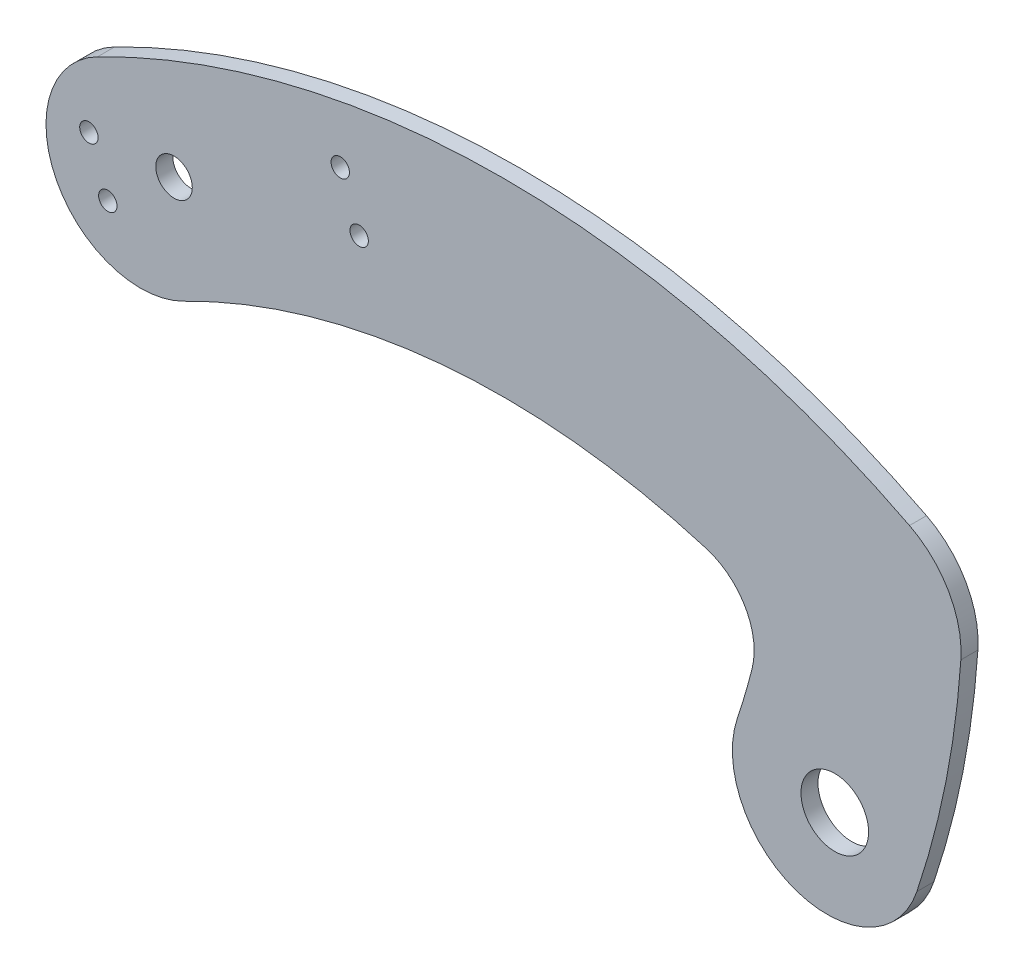
ISO-10303-21;
HEADER;
FILE_DESCRIPTION(('STEP AP214'),'2;1');
FILE_NAME('part.step','',(''),(''),'','','');
FILE_SCHEMA(('AUTOMOTIVE_DESIGN { 1 0 10303 214 1 1 1 1 }'));
ENDSEC;
DATA;
#1=APPLICATION_CONTEXT('core data for automotive mechanical design processes');
#2=APPLICATION_PROTOCOL_DEFINITION('international standard','automotive_design',2000,#1);
#3=PRODUCT_CONTEXT('',#1,'mechanical');
#4=PRODUCT('Part','Part','',(#3));
#5=PRODUCT_RELATED_PRODUCT_CATEGORY('part','',(#4));
#6=PRODUCT_DEFINITION_FORMATION('','',#4);
#7=PRODUCT_DEFINITION_CONTEXT('part definition',#1,'design');
#8=PRODUCT_DEFINITION('design','',#6,#7);
#9=PRODUCT_DEFINITION_SHAPE('','',#8);
#10=(LENGTH_UNIT() NAMED_UNIT(*) SI_UNIT(.MILLI.,.METRE.));
#11=(NAMED_UNIT(*) PLANE_ANGLE_UNIT() SI_UNIT($,.RADIAN.));
#12=(NAMED_UNIT(*) SI_UNIT($,.STERADIAN.) SOLID_ANGLE_UNIT());
#13=UNCERTAINTY_MEASURE_WITH_UNIT(LENGTH_MEASURE(1.E-05),#10,'distance_accuracy_value','');
#14=(GEOMETRIC_REPRESENTATION_CONTEXT(3) GLOBAL_UNCERTAINTY_ASSIGNED_CONTEXT((#13)) GLOBAL_UNIT_ASSIGNED_CONTEXT((#10,
#11,#12)) REPRESENTATION_CONTEXT('',''));
#15=CARTESIAN_POINT('',(0.,0.,0.));
#16=DIRECTION('',(0.,0.,1.));
#17=DIRECTION('',(1.,0.,0.));
#18=AXIS2_PLACEMENT_3D('',#15,#16,#17);
#19=CARTESIAN_POINT('',(136.301224422458,0.,3.2004));
#20=DIRECTION('',(0.,0.,-1.));
#21=DIRECTION('',(-1.,0.,0.));
#22=AXIS2_PLACEMENT_3D('',#19,#20,#21);
#23=CYLINDRICAL_SURFACE('',#22,17.7830958000237);
#24=DIRECTION('',(0.,0.,1.));
#25=VECTOR('',#24,1.);
#26=CARTESIAN_POINT('',(154.043888830047,-1.1984806850691,-84.6497383517436));
#27=LINE('',#26,#25);
#28=CARTESIAN_POINT('',(154.043888830047,-1.1984806850691,0.));
#29=VERTEX_POINT('',#28);
#30=CARTESIAN_POINT('',(154.043888830047,-1.1984806850691,3.2004));
#31=VERTEX_POINT('',#30);
#32=EDGE_CURVE('E107',#29,#31,#27,.T.);
#33=ORIENTED_EDGE('',*,*,#32,.F.);
#34=CARTESIAN_POINT('',(136.301224422458,0.,0.));
#35=DIRECTION('',(0.,0.,1.));
#36=DIRECTION('',(-1.,0.,0.));
#37=AXIS2_PLACEMENT_3D('',#34,#35,#36);
#38=CIRCLE('',#37,17.7830958000237);
#39=CARTESIAN_POINT('',(144.398322183272,15.8327352054103,0.));
#40=VERTEX_POINT('',#39);
#41=EDGE_CURVE('E104',#29,#40,#38,.T.);
#42=ORIENTED_EDGE('',*,*,#41,.T.);
#43=DIRECTION('',(0.,0.,-1.));
#44=VECTOR('',#43,1.);
#45=CARTESIAN_POINT('',(144.398322183272,15.8327352054103,3.2004));
#46=LINE('',#45,#44);
#47=CARTESIAN_POINT('',(144.398322183272,15.8327352054103,3.2004));
#48=VERTEX_POINT('',#47);
#49=EDGE_CURVE('E184',#48,#40,#46,.T.);
#50=ORIENTED_EDGE('',*,*,#49,.F.);
#51=CARTESIAN_POINT('',(136.301224422458,0.,3.2004));
#52=DIRECTION('',(0.,0.,1.));
#53=DIRECTION('',(-1.,0.,0.));
#54=AXIS2_PLACEMENT_3D('',#51,#52,#53);
#55=CIRCLE('',#54,17.7830958000237);
#56=EDGE_CURVE('E162',#31,#48,#55,.T.);
#57=ORIENTED_EDGE('',*,*,#56,.F.);
#58=EDGE_LOOP('',(#33,#42,#50,#57));
#59=FACE_BOUND('',#58,.T.);
#60=ADVANCED_FACE('F33',(#59),#23,.T.);
#61=CARTESIAN_POINT('',(68.150612211229,-133.258931669179,3.2004));
#62=DIRECTION('',(0.,0.,-1.));
#63=DIRECTION('',(-1.,0.,0.));
#64=AXIS2_PLACEMENT_3D('',#61,#62,#63);
#65=CYLINDRICAL_SURFACE('',#64,167.457571962047);
#66=CARTESIAN_POINT('',(68.150612211229,-133.258931669179,0.));
#67=DIRECTION('',(0.,0.,1.));
#68=DIRECTION('',(-1.,0.,0.));
#69=AXIS2_PLACEMENT_3D('',#66,#67,#68);
#70=CIRCLE('',#69,167.457571962047);
#71=CARTESIAN_POINT('',(-8.09709776081412,15.8327352054103,0.));
#72=VERTEX_POINT('',#71);
#73=EDGE_CURVE('E173',#40,#72,#70,.T.);
#74=ORIENTED_EDGE('',*,*,#73,.T.);
#75=DIRECTION('',(0.,0.,-1.));
#76=VECTOR('',#75,1.);
#77=CARTESIAN_POINT('',(-8.09709776081412,15.8327352054103,3.2004));
#78=LINE('',#77,#76);
#79=CARTESIAN_POINT('',(-8.09709776081412,15.8327352054103,3.2004));
#80=VERTEX_POINT('',#79);
#81=EDGE_CURVE('E181',#80,#72,#78,.T.);
#82=ORIENTED_EDGE('',*,*,#81,.F.);
#83=CARTESIAN_POINT('',(68.150612211229,-133.258931669179,3.2004));
#84=DIRECTION('',(0.,0.,1.));
#85=DIRECTION('',(-1.,0.,0.));
#86=AXIS2_PLACEMENT_3D('',#83,#84,#85);
#87=CIRCLE('',#86,167.457571962047);
#88=EDGE_CURVE('E164',#48,#80,#87,.T.);
#89=ORIENTED_EDGE('',*,*,#88,.F.);
#90=ORIENTED_EDGE('',*,*,#49,.T.);
#91=EDGE_LOOP('',(#74,#82,#89,#90));
#92=FACE_BOUND('',#91,.T.);
#93=ADVANCED_FACE('F214',(#92),#65,.T.);
#94=CARTESIAN_POINT('',(0.,0.,3.2004));
#95=DIRECTION('',(0.,0.,-1.));
#96=DIRECTION('',(-1.,0.,0.));
#97=AXIS2_PLACEMENT_3D('',#94,#95,#96);
#98=CYLINDRICAL_SURFACE('',#97,17.7830958000237);
#99=CARTESIAN_POINT('',(0.,0.,0.));
#100=DIRECTION('',(0.,0.,1.));
#101=DIRECTION('',(1.,0.,0.));
#102=AXIS2_PLACEMENT_3D('',#99,#100,#101);
#103=CIRCLE('',#102,17.7830958000237);
#104=CARTESIAN_POINT('',(8.09709776081412,-15.8327352054103,0.));
#105=VERTEX_POINT('',#104);
#106=EDGE_CURVE('E175',#72,#105,#103,.T.);
#107=ORIENTED_EDGE('',*,*,#106,.T.);
#108=DIRECTION('',(0.,0.,-1.));
#109=VECTOR('',#108,1.);
#110=CARTESIAN_POINT('',(8.09709776081412,-15.8327352054103,3.2004));
#111=LINE('',#110,#109);
#112=CARTESIAN_POINT('',(8.09709776081412,-15.8327352054103,3.2004));
#113=VERTEX_POINT('',#112);
#114=EDGE_CURVE('E171',#113,#105,#111,.T.);
#115=ORIENTED_EDGE('',*,*,#114,.F.);
#116=CARTESIAN_POINT('',(0.,0.,3.2004));
#117=DIRECTION('',(0.,0.,1.));
#118=DIRECTION('',(1.,0.,0.));
#119=AXIS2_PLACEMENT_3D('',#116,#117,#118);
#120=CIRCLE('',#119,17.7830958000237);
#121=EDGE_CURVE('E167',#80,#113,#120,.T.);
#122=ORIENTED_EDGE('',*,*,#121,.F.);
#123=ORIENTED_EDGE('',*,*,#81,.T.);
#124=EDGE_LOOP('',(#107,#115,#122,#123));
#125=FACE_BOUND('',#124,.T.);
#126=ADVANCED_FACE('F204',(#125),#98,.T.);
#127=CARTESIAN_POINT('',(68.150612211229,-133.258931669179,3.2004));
#128=DIRECTION('',(0.,0.,-1.));
#129=DIRECTION('',(-1.,0.,0.));
#130=AXIS2_PLACEMENT_3D('',#127,#128,#129);
#131=CYLINDRICAL_SURFACE('',#130,131.891380362);
#132=CARTESIAN_POINT('',(68.150612211229,-133.258931669179,0.));
#133=DIRECTION('',(0.,0.,-1.));
#134=DIRECTION('',(-1.,0.,0.));
#135=AXIS2_PLACEMENT_3D('',#132,#133,#134);
#136=CIRCLE('',#135,131.891380362);
#137=CARTESIAN_POINT('',(106.18403029329,-6.97039171883765,0.));
#138=VERTEX_POINT('',#137);
#139=EDGE_CURVE('E165',#105,#138,#136,.T.);
#140=ORIENTED_EDGE('',*,*,#139,.T.);
#141=DIRECTION('',(0.,0.,-1.));
#142=VECTOR('',#141,1.);
#143=CARTESIAN_POINT('',(106.18403029329,-6.97039171883765,3.2004));
#144=LINE('',#143,#142);
#145=CARTESIAN_POINT('',(106.18403029329,-6.97039171883765,3.2004));
#146=VERTEX_POINT('',#145);
#147=EDGE_CURVE('E187',#138,#146,#144,.F.);
#148=ORIENTED_EDGE('',*,*,#147,.T.);
#149=CARTESIAN_POINT('',(68.150612211229,-133.258931669179,3.2004));
#150=DIRECTION('',(0.,0.,-1.));
#151=DIRECTION('',(-1.,0.,0.));
#152=AXIS2_PLACEMENT_3D('',#149,#150,#151);
#153=CIRCLE('',#152,131.891380362);
#154=EDGE_CURVE('E169',#113,#146,#153,.T.);
#155=ORIENTED_EDGE('',*,*,#154,.F.);
#156=ORIENTED_EDGE('',*,*,#114,.T.);
#157=EDGE_LOOP('',(#140,#148,#155,#156));
#158=FACE_BOUND('',#157,.T.);
#159=ADVANCED_FACE('F193',(#158),#131,.F.);
#160=CARTESIAN_POINT('',(102.225918316843,-66.6294658345895,3.2004));
#161=DIRECTION('',(0.,0.,-1.));
#162=DIRECTION('',(-1.,0.,0.));
#163=AXIS2_PLACEMENT_3D('',#160,#161,#162);
#164=PLANE('',#163);
#165=CARTESIAN_POINT('',(130.361522506201,-37.8607045713044,3.2004));
#166=DIRECTION('',(0.,0.,1.));
#167=DIRECTION('',(1.,0.,0.));
#168=AXIS2_PLACEMENT_3D('',#165,#166,#167);
#169=CIRCLE('',#168,6.35);
#170=CARTESIAN_POINT('',(136.711522506201,-37.8607045713044,3.2004));
#171=VERTEX_POINT('',#170);
#172=EDGE_CURVE('E262',#171,#171,#169,.T.);
#173=ORIENTED_EDGE('',*,*,#172,.F.);
#174=EDGE_LOOP('',(#173));
#175=FACE_BOUND('',#174,.T.);
#176=CARTESIAN_POINT('',(-13.0329539898844,10.0872182630756,3.2004));
#177=DIRECTION('',(0.,0.,1.));
#178=DIRECTION('',(-1.,0.,0.));
#179=AXIS2_PLACEMENT_3D('',#176,#177,#178);
#180=CIRCLE('',#179,167.457571962047);
#181=CARTESIAN_POINT('',(145.781416871047,-43.016774199552,3.2004));
#182=VERTEX_POINT('',#181);
#183=EDGE_CURVE('E113',#182,#31,#180,.T.);
#184=ORIENTED_EDGE('',*,*,#183,.T.);
#185=ORIENTED_EDGE('',*,*,#56,.T.);
#186=ORIENTED_EDGE('',*,*,#88,.T.);
#187=ORIENTED_EDGE('',*,*,#121,.T.);
#188=ORIENTED_EDGE('',*,*,#154,.T.);
#189=CARTESIAN_POINT('',(102.521740852415,-19.1308866121903,3.20040000000001));
#190=DIRECTION('',(0.,0.,-1.));
#191=DIRECTION('',(-1.,0.,0.));
#192=AXIS2_PLACEMENT_3D('',#189,#190,#191);
#193=CIRCLE('',#192,12.7);
#194=CARTESIAN_POINT('',(114.834247176615,-22.2441145216993,3.2004));
#195=VERTEX_POINT('',#194);
#196=EDGE_CURVE('E41',#146,#195,#193,.T.);
#197=ORIENTED_EDGE('',*,*,#196,.T.);
#198=CARTESIAN_POINT('',(-13.0329539898844,10.0872182630756,3.2004));
#199=DIRECTION('',(0.,0.,-1.));
#200=DIRECTION('',(-1.,0.,0.));
#201=AXIS2_PLACEMENT_3D('',#198,#199,#200);
#202=CIRCLE('',#201,131.891380362);
#203=CARTESIAN_POINT('',(112.0509484503,-31.7380559635003,3.2004));
#204=VERTEX_POINT('',#203);
#205=EDGE_CURVE('E126',#195,#204,#202,.T.);
#206=ORIENTED_EDGE('',*,*,#205,.T.);
#207=CARTESIAN_POINT('',(128.916182660673,-37.3774150815262,3.2004));
#208=DIRECTION('',(0.,0.,1.));
#209=DIRECTION('',(1.,0.,0.));
#210=AXIS2_PLACEMENT_3D('',#207,#208,#209);
#211=CIRCLE('',#210,17.7830958000237);
#212=EDGE_CURVE('E122',#204,#182,#211,.T.);
#213=ORIENTED_EDGE('',*,*,#212,.T.);
#214=EDGE_LOOP('',(#184,#185,#186,#187,#188,#197,#206,#213));
#215=FACE_BOUND('',#214,.T.);
#216=CARTESIAN_POINT('',(41.0333650737775,11.3002667992436,3.2004));
#217=DIRECTION('',(0.,0.,1.));
#218=DIRECTION('',(1.,0.,0.));
#219=AXIS2_PLACEMENT_3D('',#216,#217,#218);
#220=CIRCLE('',#219,1.72720000000724);
#221=CARTESIAN_POINT('',(42.7605650737847,11.3002667992436,3.2004));
#222=VERTEX_POINT('',#221);
#223=EDGE_CURVE('E145',#222,#222,#220,.T.);
#224=ORIENTED_EDGE('',*,*,#223,.F.);
#225=EDGE_LOOP('',(#224));
#226=FACE_BOUND('',#225,.T.);
#227=CARTESIAN_POINT('',(-9.72580276055649,2.71208355842273,3.2004));
#228=DIRECTION('',(0.,0.,1.));
#229=DIRECTION('',(1.,0.,0.));
#230=AXIS2_PLACEMENT_3D('',#227,#228,#229);
#231=CIRCLE('',#230,1.72720000000726);
#232=CARTESIAN_POINT('',(-7.99860276054923,2.71208355842273,3.2004));
#233=VERTEX_POINT('',#232);
#234=EDGE_CURVE('E140',#233,#233,#231,.T.);
#235=ORIENTED_EDGE('',*,*,#234,.F.);
#236=EDGE_LOOP('',(#235));
#237=FACE_BOUND('',#236,.T.);
#238=CARTESIAN_POINT('',(-6.17408145657206,-6.6359257001747,3.2004));
#239=DIRECTION('',(0.,0.,1.));
#240=DIRECTION('',(1.,0.,0.));
#241=AXIS2_PLACEMENT_3D('',#238,#239,#240);
#242=CIRCLE('',#241,1.72720000000725);
#243=CARTESIAN_POINT('',(-4.44688145656481,-6.6359257001747,3.2004));
#244=VERTEX_POINT('',#243);
#245=EDGE_CURVE('E133',#244,#244,#242,.T.);
#246=ORIENTED_EDGE('',*,*,#245,.F.);
#247=EDGE_LOOP('',(#246));
#248=FACE_BOUND('',#247,.T.);
#249=CARTESIAN_POINT('',(37.4816437697931,20.648276057841,3.2004));
#250=DIRECTION('',(0.,0.,1.));
#251=DIRECTION('',(1.,0.,0.));
#252=AXIS2_PLACEMENT_3D('',#249,#250,#251);
#253=CIRCLE('',#252,1.72720000000725);
#254=CARTESIAN_POINT('',(39.2088437698003,20.648276057841,3.2004));
#255=VERTEX_POINT('',#254);
#256=EDGE_CURVE('E132',#255,#255,#253,.T.);
#257=ORIENTED_EDGE('',*,*,#256,.F.);
#258=EDGE_LOOP('',(#257));
#259=FACE_BOUND('',#258,.T.);
#260=CARTESIAN_POINT('',(6.26183634265892,3.43776081821638,3.2004));
#261=DIRECTION('',(0.,0.,1.));
#262=DIRECTION('',(1.,0.,0.));
#263=AXIS2_PLACEMENT_3D('',#260,#261,#262);
#264=CIRCLE('',#263,3.42900000000725);
#265=CARTESIAN_POINT('',(9.69083634266617,3.43776081821638,3.2004));
#266=VERTEX_POINT('',#265);
#267=EDGE_CURVE('E152',#266,#266,#264,.T.);
#268=ORIENTED_EDGE('',*,*,#267,.F.);
#269=EDGE_LOOP('',(#268));
#270=FACE_BOUND('',#269,.T.);
#271=ADVANCED_FACE('F197',(#175,#215,#226,#237,#248,#259,#270),#164,.F.);
#272=CARTESIAN_POINT('',(102.225918316843,-66.6294658345895,0.));
#273=DIRECTION('',(0.,0.,-1.));
#274=DIRECTION('',(-1.,0.,0.));
#275=AXIS2_PLACEMENT_3D('',#272,#273,#274);
#276=PLANE('',#275);
#277=CARTESIAN_POINT('',(130.361522506201,-37.8607045713044,0.));
#278=DIRECTION('',(0.,0.,-1.));
#279=DIRECTION('',(-1.,0.,0.));
#280=AXIS2_PLACEMENT_3D('',#277,#278,#279);
#281=CIRCLE('',#280,6.35);
#282=CARTESIAN_POINT('',(124.011522506201,-37.8607045713044,0.));
#283=VERTEX_POINT('',#282);
#284=EDGE_CURVE('E260',#283,#283,#281,.F.);
#285=ORIENTED_EDGE('',*,*,#284,.T.);
#286=EDGE_LOOP('',(#285));
#287=FACE_BOUND('',#286,.T.);
#288=ORIENTED_EDGE('',*,*,#41,.F.);
#289=CARTESIAN_POINT('',(-13.0329539898844,10.0872182630756,0.));
#290=DIRECTION('',(0.,0.,-1.));
#291=DIRECTION('',(-1.,0.,0.));
#292=AXIS2_PLACEMENT_3D('',#289,#290,#291);
#293=CIRCLE('',#292,167.457571962047);
#294=CARTESIAN_POINT('',(145.781416871047,-43.016774199552,0.));
#295=VERTEX_POINT('',#294);
#296=EDGE_CURVE('E96',#295,#29,#293,.F.);
#297=ORIENTED_EDGE('',*,*,#296,.F.);
#298=CARTESIAN_POINT('',(128.916182660673,-37.3774150815262,0.));
#299=DIRECTION('',(0.,0.,-1.));
#300=DIRECTION('',(-1.,0.,0.));
#301=AXIS2_PLACEMENT_3D('',#298,#299,#300);
#302=CIRCLE('',#301,17.7830958000237);
#303=CARTESIAN_POINT('',(112.0509484503,-31.7380559635003,0.));
#304=VERTEX_POINT('',#303);
#305=EDGE_CURVE('E101',#304,#295,#302,.F.);
#306=ORIENTED_EDGE('',*,*,#305,.F.);
#307=CARTESIAN_POINT('',(-13.0329539898844,10.0872182630756,0.));
#308=DIRECTION('',(0.,0.,-1.));
#309=DIRECTION('',(-1.,0.,0.));
#310=AXIS2_PLACEMENT_3D('',#307,#308,#309);
#311=CIRCLE('',#310,131.891380362);
#312=CARTESIAN_POINT('',(114.834247176615,-22.2441145216993,0.));
#313=VERTEX_POINT('',#312);
#314=EDGE_CURVE('E128',#313,#304,#311,.T.);
#315=ORIENTED_EDGE('',*,*,#314,.F.);
#316=CARTESIAN_POINT('',(102.521740852415,-19.1308866121903,0.));
#317=DIRECTION('',(0.,0.,-1.));
#318=DIRECTION('',(-1.,0.,0.));
#319=AXIS2_PLACEMENT_3D('',#316,#317,#318);
#320=CIRCLE('',#319,12.7);
#321=EDGE_CURVE('E11',#313,#138,#320,.F.);
#322=ORIENTED_EDGE('',*,*,#321,.T.);
#323=ORIENTED_EDGE('',*,*,#139,.F.);
#324=ORIENTED_EDGE('',*,*,#106,.F.);
#325=ORIENTED_EDGE('',*,*,#73,.F.);
#326=EDGE_LOOP('',(#288,#297,#306,#315,#322,#323,#324,#325));
#327=FACE_BOUND('',#326,.T.);
#328=CARTESIAN_POINT('',(6.26183634265892,3.43776081821638,0.));
#329=DIRECTION('',(0.,0.,-1.));
#330=DIRECTION('',(-1.,0.,0.));
#331=AXIS2_PLACEMENT_3D('',#328,#329,#330);
#332=CIRCLE('',#331,3.42900000000725);
#333=CARTESIAN_POINT('',(2.83283634265168,3.43776081821638,0.));
#334=VERTEX_POINT('',#333);
#335=EDGE_CURVE('E159',#334,#334,#332,.F.);
#336=ORIENTED_EDGE('',*,*,#335,.T.);
#337=EDGE_LOOP('',(#336));
#338=FACE_BOUND('',#337,.T.);
#339=CARTESIAN_POINT('',(37.4816437697931,20.648276057841,0.));
#340=DIRECTION('',(0.,0.,-1.));
#341=DIRECTION('',(-1.,0.,0.));
#342=AXIS2_PLACEMENT_3D('',#339,#340,#341);
#343=CIRCLE('',#342,1.72720000000725);
#344=CARTESIAN_POINT('',(35.7544437697858,20.648276057841,0.));
#345=VERTEX_POINT('',#344);
#346=EDGE_CURVE('E137',#345,#345,#343,.F.);
#347=ORIENTED_EDGE('',*,*,#346,.T.);
#348=EDGE_LOOP('',(#347));
#349=FACE_BOUND('',#348,.T.);
#350=CARTESIAN_POINT('',(-6.17408145657206,-6.6359257001747,0.));
#351=DIRECTION('',(0.,0.,-1.));
#352=DIRECTION('',(-1.,0.,0.));
#353=AXIS2_PLACEMENT_3D('',#350,#351,#352);
#354=CIRCLE('',#353,1.72720000000725);
#355=CARTESIAN_POINT('',(-7.90128145657932,-6.6359257001747,0.));
#356=VERTEX_POINT('',#355);
#357=EDGE_CURVE('E136',#356,#356,#354,.F.);
#358=ORIENTED_EDGE('',*,*,#357,.T.);
#359=EDGE_LOOP('',(#358));
#360=FACE_BOUND('',#359,.T.);
#361=CARTESIAN_POINT('',(-9.72580276055649,2.71208355842273,0.));
#362=DIRECTION('',(0.,0.,-1.));
#363=DIRECTION('',(-1.,0.,0.));
#364=AXIS2_PLACEMENT_3D('',#361,#362,#363);
#365=CIRCLE('',#364,1.72720000000726);
#366=CARTESIAN_POINT('',(-11.4530027605637,2.71208355842273,0.));
#367=VERTEX_POINT('',#366);
#368=EDGE_CURVE('E149',#367,#367,#365,.F.);
#369=ORIENTED_EDGE('',*,*,#368,.T.);
#370=EDGE_LOOP('',(#369));
#371=FACE_BOUND('',#370,.T.);
#372=CARTESIAN_POINT('',(41.0333650737775,11.3002667992436,0.));
#373=DIRECTION('',(0.,0.,-1.));
#374=DIRECTION('',(-1.,0.,0.));
#375=AXIS2_PLACEMENT_3D('',#372,#373,#374);
#376=CIRCLE('',#375,1.72720000000724);
#377=CARTESIAN_POINT('',(39.3061650737702,11.3002667992436,0.));
#378=VERTEX_POINT('',#377);
#379=EDGE_CURVE('E148',#378,#378,#376,.F.);
#380=ORIENTED_EDGE('',*,*,#379,.T.);
#381=EDGE_LOOP('',(#380));
#382=FACE_BOUND('',#381,.T.);
#383=ADVANCED_FACE('F98',(#287,#327,#338,#349,#360,#371,#382),#276,.T.);
#384=CARTESIAN_POINT('',(6.26183634265892,3.43776081821638,-9.69867661077519));
#385=DIRECTION('',(0.,0.,1.));
#386=DIRECTION('',(1.,0.,0.));
#387=AXIS2_PLACEMENT_3D('',#384,#385,#386);
#388=CYLINDRICAL_SURFACE('',#387,3.42900000000725);
#389=ORIENTED_EDGE('',*,*,#267,.T.);
#390=EDGE_LOOP('',(#389));
#391=FACE_BOUND('',#390,.T.);
#392=ORIENTED_EDGE('',*,*,#335,.F.);
#393=EDGE_LOOP('',(#392));
#394=FACE_BOUND('',#393,.T.);
#395=ADVANCED_FACE('F228',(#391,#394),#388,.F.);
#396=CARTESIAN_POINT('',(37.4816437697931,20.648276057841,-9.69867661077519));
#397=DIRECTION('',(0.,0.,1.));
#398=DIRECTION('',(1.,0.,0.));
#399=AXIS2_PLACEMENT_3D('',#396,#397,#398);
#400=CYLINDRICAL_SURFACE('',#399,1.72720000000725);
#401=ORIENTED_EDGE('',*,*,#256,.T.);
#402=EDGE_LOOP('',(#401));
#403=FACE_BOUND('',#402,.T.);
#404=ORIENTED_EDGE('',*,*,#346,.F.);
#405=EDGE_LOOP('',(#404));
#406=FACE_BOUND('',#405,.T.);
#407=ADVANCED_FACE('F235',(#403,#406),#400,.F.);
#408=CARTESIAN_POINT('',(-6.17408145657206,-6.6359257001747,-9.69867661077519));
#409=DIRECTION('',(0.,0.,1.));
#410=DIRECTION('',(1.,0.,0.));
#411=AXIS2_PLACEMENT_3D('',#408,#409,#410);
#412=CYLINDRICAL_SURFACE('',#411,1.72720000000725);
#413=ORIENTED_EDGE('',*,*,#245,.T.);
#414=EDGE_LOOP('',(#413));
#415=FACE_BOUND('',#414,.T.);
#416=ORIENTED_EDGE('',*,*,#357,.F.);
#417=EDGE_LOOP('',(#416));
#418=FACE_BOUND('',#417,.T.);
#419=ADVANCED_FACE('F241',(#415,#418),#412,.F.);
#420=CARTESIAN_POINT('',(-9.72580276055649,2.71208355842273,-9.69867661077519));
#421=DIRECTION('',(0.,0.,1.));
#422=DIRECTION('',(1.,0.,0.));
#423=AXIS2_PLACEMENT_3D('',#420,#421,#422);
#424=CYLINDRICAL_SURFACE('',#423,1.72720000000726);
#425=ORIENTED_EDGE('',*,*,#234,.T.);
#426=EDGE_LOOP('',(#425));
#427=FACE_BOUND('',#426,.T.);
#428=ORIENTED_EDGE('',*,*,#368,.F.);
#429=EDGE_LOOP('',(#428));
#430=FACE_BOUND('',#429,.T.);
#431=ADVANCED_FACE('F237',(#427,#430),#424,.F.);
#432=CARTESIAN_POINT('',(41.0333650737775,11.3002667992436,-9.69867661077519));
#433=DIRECTION('',(0.,0.,1.));
#434=DIRECTION('',(1.,0.,0.));
#435=AXIS2_PLACEMENT_3D('',#432,#433,#434);
#436=CYLINDRICAL_SURFACE('',#435,1.72720000000724);
#437=ORIENTED_EDGE('',*,*,#223,.T.);
#438=EDGE_LOOP('',(#437));
#439=FACE_BOUND('',#438,.T.);
#440=ORIENTED_EDGE('',*,*,#379,.F.);
#441=EDGE_LOOP('',(#440));
#442=FACE_BOUND('',#441,.T.);
#443=ADVANCED_FACE('F240',(#439,#442),#436,.F.);
#444=CARTESIAN_POINT('',(-13.0329539898844,10.0872182630756,-84.6497383517436));
#445=DIRECTION('',(0.,0.,1.));
#446=DIRECTION('',(1.,0.,0.));
#447=AXIS2_PLACEMENT_3D('',#444,#445,#446);
#448=CYLINDRICAL_SURFACE('',#447,131.891380362);
#449=ORIENTED_EDGE('',*,*,#205,.F.);
#450=DIRECTION('',(0.,0.,1.));
#451=VECTOR('',#450,1.);
#452=CARTESIAN_POINT('',(114.834247176615,-22.2441145216993,-84.6497383517436));
#453=LINE('',#452,#451);
#454=EDGE_CURVE('E54',#195,#313,#453,.F.);
#455=ORIENTED_EDGE('',*,*,#454,.T.);
#456=ORIENTED_EDGE('',*,*,#314,.T.);
#457=DIRECTION('',(0.,0.,1.));
#458=VECTOR('',#457,1.);
#459=CARTESIAN_POINT('',(112.0509484503,-31.7380559635003,-84.6497383517436));
#460=LINE('',#459,#458);
#461=EDGE_CURVE('E120',#304,#204,#460,.T.);
#462=ORIENTED_EDGE('',*,*,#461,.T.);
#463=EDGE_LOOP('',(#449,#455,#456,#462));
#464=FACE_BOUND('',#463,.T.);
#465=ADVANCED_FACE('F245',(#464),#448,.F.);
#466=CARTESIAN_POINT('',(128.916182660673,-37.3774150815262,-84.6497383517436));
#467=DIRECTION('',(0.,0.,1.));
#468=DIRECTION('',(1.,0.,0.));
#469=AXIS2_PLACEMENT_3D('',#466,#467,#468);
#470=CYLINDRICAL_SURFACE('',#469,17.7830958000237);
#471=ORIENTED_EDGE('',*,*,#461,.F.);
#472=ORIENTED_EDGE('',*,*,#305,.T.);
#473=DIRECTION('',(0.,0.,1.));
#474=VECTOR('',#473,1.);
#475=CARTESIAN_POINT('',(145.781416871047,-43.016774199552,-84.6497383517436));
#476=LINE('',#475,#474);
#477=EDGE_CURVE('E108',#295,#182,#476,.T.);
#478=ORIENTED_EDGE('',*,*,#477,.T.);
#479=ORIENTED_EDGE('',*,*,#212,.F.);
#480=EDGE_LOOP('',(#471,#472,#478,#479));
#481=FACE_BOUND('',#480,.T.);
#482=ADVANCED_FACE('F118',(#481),#470,.T.);
#483=CARTESIAN_POINT('',(-13.0329539898844,10.0872182630756,-84.6497383517436));
#484=DIRECTION('',(0.,0.,1.));
#485=DIRECTION('',(1.,0.,0.));
#486=AXIS2_PLACEMENT_3D('',#483,#484,#485);
#487=CYLINDRICAL_SURFACE('',#486,167.457571962047);
#488=ORIENTED_EDGE('',*,*,#477,.F.);
#489=ORIENTED_EDGE('',*,*,#296,.T.);
#490=ORIENTED_EDGE('',*,*,#32,.T.);
#491=ORIENTED_EDGE('',*,*,#183,.F.);
#492=EDGE_LOOP('',(#488,#489,#490,#491));
#493=FACE_BOUND('',#492,.T.);
#494=ADVANCED_FACE('F111',(#493),#487,.T.);
#495=CARTESIAN_POINT('',(130.361522506201,-37.8607045713044,-17.9605122421383));
#496=DIRECTION('',(0.,0.,1.));
#497=DIRECTION('',(1.,0.,0.));
#498=AXIS2_PLACEMENT_3D('',#495,#496,#497);
#499=CYLINDRICAL_SURFACE('',#498,6.35);
#500=ORIENTED_EDGE('',*,*,#172,.T.);
#501=EDGE_LOOP('',(#500));
#502=FACE_BOUND('',#501,.T.);
#503=ORIENTED_EDGE('',*,*,#284,.F.);
#504=EDGE_LOOP('',(#503));
#505=FACE_BOUND('',#504,.T.);
#506=ADVANCED_FACE('F207',(#502,#505),#499,.F.);
#507=CARTESIAN_POINT('',(102.521740852415,-19.1308866121903,-84.6497383517436));
#508=DIRECTION('',(0.,0.,-1.));
#509=DIRECTION('',(-1.,0.,0.));
#510=AXIS2_PLACEMENT_3D('',#507,#508,#509);
#511=CYLINDRICAL_SURFACE('',#510,12.7);
#512=ORIENTED_EDGE('',*,*,#321,.F.);
#513=ORIENTED_EDGE('',*,*,#454,.F.);
#514=ORIENTED_EDGE('',*,*,#196,.F.);
#515=ORIENTED_EDGE('',*,*,#147,.F.);
#516=EDGE_LOOP('',(#512,#513,#514,#515));
#517=FACE_BOUND('',#516,.T.);
#518=ADVANCED_FACE('F35',(#517),#511,.F.);
#519=CLOSED_SHELL('',(#60,#93,#126,#159,#271,#383,#395,#407,#419,#431,#443,#465,#482,#494,#506,#518));
#520=MANIFOLD_SOLID_BREP('B2',#519);
#521=ADVANCED_BREP_SHAPE_REPRESENTATION('',(#18,#520),#14);
#522=SHAPE_DEFINITION_REPRESENTATION(#9,#521);
ENDSEC;
END-ISO-10303-21;
